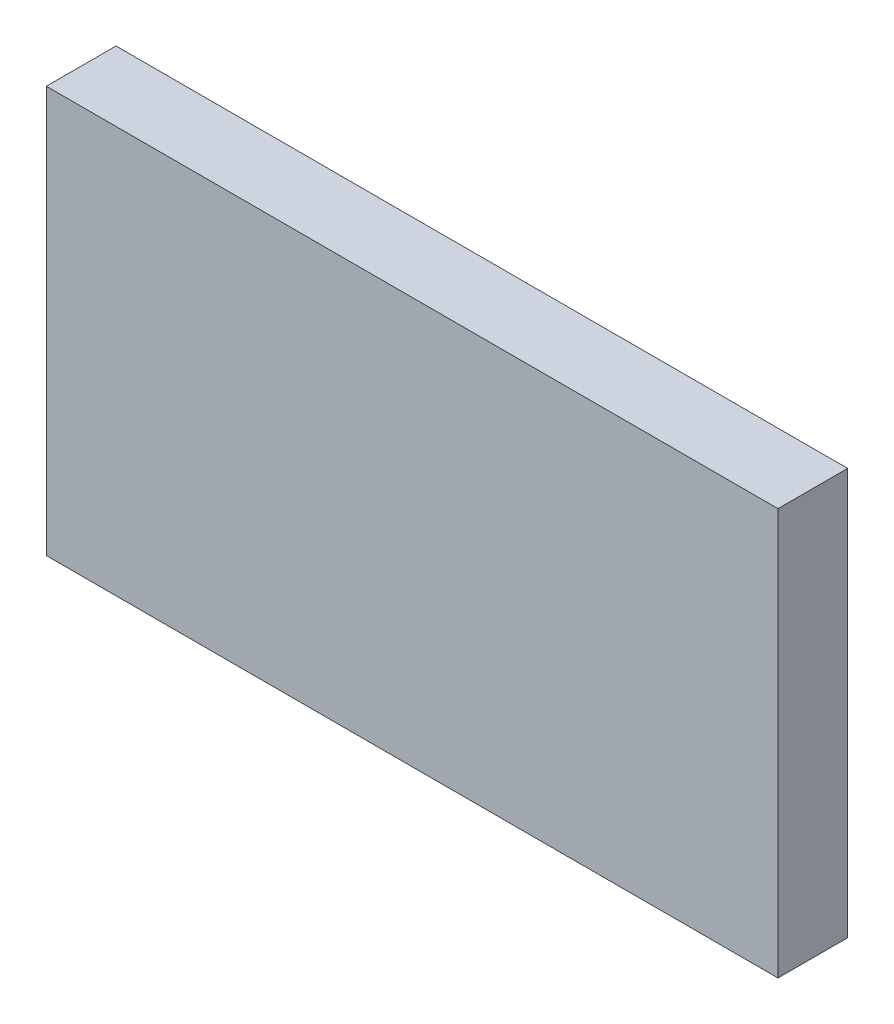
ISO-10303-21;
HEADER;
FILE_DESCRIPTION(('STEP AP214'),'2;1');
FILE_NAME('part.step','',(''),(''),'','','');
FILE_SCHEMA(('AUTOMOTIVE_DESIGN { 1 0 10303 214 1 1 1 1 }'));
ENDSEC;
DATA;
#1=APPLICATION_CONTEXT('core data for automotive mechanical design processes');
#2=APPLICATION_PROTOCOL_DEFINITION('international standard','automotive_design',2000,#1);
#3=PRODUCT_CONTEXT('',#1,'mechanical');
#4=PRODUCT('Part','Part','',(#3));
#5=PRODUCT_RELATED_PRODUCT_CATEGORY('part','',(#4));
#6=PRODUCT_DEFINITION_FORMATION('','',#4);
#7=PRODUCT_DEFINITION_CONTEXT('part definition',#1,'design');
#8=PRODUCT_DEFINITION('design','',#6,#7);
#9=PRODUCT_DEFINITION_SHAPE('','',#8);
#10=(LENGTH_UNIT() NAMED_UNIT(*) SI_UNIT(.MILLI.,.METRE.));
#11=(NAMED_UNIT(*) PLANE_ANGLE_UNIT() SI_UNIT($,.RADIAN.));
#12=(NAMED_UNIT(*) SI_UNIT($,.STERADIAN.) SOLID_ANGLE_UNIT());
#13=UNCERTAINTY_MEASURE_WITH_UNIT(LENGTH_MEASURE(1.E-05),#10,'distance_accuracy_value','');
#14=(GEOMETRIC_REPRESENTATION_CONTEXT(3) GLOBAL_UNCERTAINTY_ASSIGNED_CONTEXT((#13)) GLOBAL_UNIT_ASSIGNED_CONTEXT((#10,
#11,#12)) REPRESENTATION_CONTEXT('',''));
#15=CARTESIAN_POINT('',(0.,0.,0.));
#16=DIRECTION('',(0.,0.,1.));
#17=DIRECTION('',(1.,0.,0.));
#18=AXIS2_PLACEMENT_3D('',#15,#16,#17);
#19=CARTESIAN_POINT('',(0.,0.,12.));
#20=DIRECTION('',(1.,0.,0.));
#21=DIRECTION('',(0.,0.,-1.));
#22=AXIS2_PLACEMENT_3D('',#19,#20,#21);
#23=PLANE('',#22);
#24=DIRECTION('',(0.,-1.,0.));
#25=VECTOR('',#24,1.);
#26=CARTESIAN_POINT('',(0.,0.,0.));
#27=LINE('',#26,#25);
#28=CARTESIAN_POINT('',(0.,70.,0.));
#29=VERTEX_POINT('',#28);
#30=CARTESIAN_POINT('',(0.,0.,0.));
#31=VERTEX_POINT('',#30);
#32=EDGE_CURVE('E96',#29,#31,#27,.T.);
#33=ORIENTED_EDGE('',*,*,#32,.T.);
#34=DIRECTION('',(0.,0.,-1.));
#35=VECTOR('',#34,1.);
#36=CARTESIAN_POINT('',(0.,0.,12.));
#37=LINE('',#36,#35);
#38=CARTESIAN_POINT('',(0.,0.,12.));
#39=VERTEX_POINT('',#38);
#40=EDGE_CURVE('E11',#39,#31,#37,.T.);
#41=ORIENTED_EDGE('',*,*,#40,.F.);
#42=DIRECTION('',(0.,-1.,0.));
#43=VECTOR('',#42,1.);
#44=CARTESIAN_POINT('',(0.,0.,12.));
#45=LINE('',#44,#43);
#46=CARTESIAN_POINT('',(0.,70.,12.));
#47=VERTEX_POINT('',#46);
#48=EDGE_CURVE('E84',#47,#39,#45,.T.);
#49=ORIENTED_EDGE('',*,*,#48,.F.);
#50=DIRECTION('',(0.,0.,-1.));
#51=VECTOR('',#50,1.);
#52=CARTESIAN_POINT('',(0.,70.,12.));
#53=LINE('',#52,#51);
#54=EDGE_CURVE('E92',#47,#29,#53,.T.);
#55=ORIENTED_EDGE('',*,*,#54,.T.);
#56=EDGE_LOOP('',(#33,#41,#49,#55));
#57=FACE_BOUND('',#56,.T.);
#58=ADVANCED_FACE('F33',(#57),#23,.F.);
#59=CARTESIAN_POINT('',(0.,0.,12.));
#60=DIRECTION('',(0.,1.,0.));
#61=DIRECTION('',(0.,0.,1.));
#62=AXIS2_PLACEMENT_3D('',#59,#60,#61);
#63=PLANE('',#62);
#64=DIRECTION('',(1.,0.,0.));
#65=VECTOR('',#64,1.);
#66=CARTESIAN_POINT('',(0.,0.,0.));
#67=LINE('',#66,#65);
#68=CARTESIAN_POINT('',(126.,0.,0.));
#69=VERTEX_POINT('',#68);
#70=EDGE_CURVE('E88',#31,#69,#67,.T.);
#71=ORIENTED_EDGE('',*,*,#70,.T.);
#72=DIRECTION('',(0.,0.,-1.));
#73=VECTOR('',#72,1.);
#74=CARTESIAN_POINT('',(126.,0.,12.));
#75=LINE('',#74,#73);
#76=CARTESIAN_POINT('',(126.,0.,12.));
#77=VERTEX_POINT('',#76);
#78=EDGE_CURVE('E41',#77,#69,#75,.T.);
#79=ORIENTED_EDGE('',*,*,#78,.F.);
#80=DIRECTION('',(1.,0.,0.));
#81=VECTOR('',#80,1.);
#82=CARTESIAN_POINT('',(0.,0.,12.));
#83=LINE('',#82,#81);
#84=EDGE_CURVE('E79',#39,#77,#83,.T.);
#85=ORIENTED_EDGE('',*,*,#84,.F.);
#86=ORIENTED_EDGE('',*,*,#40,.T.);
#87=EDGE_LOOP('',(#71,#79,#85,#86));
#88=FACE_BOUND('',#87,.T.);
#89=ADVANCED_FACE('F87',(#88),#63,.F.);
#90=CARTESIAN_POINT('',(126.,0.,12.));
#91=DIRECTION('',(-1.,0.,0.));
#92=DIRECTION('',(0.,0.,1.));
#93=AXIS2_PLACEMENT_3D('',#90,#91,#92);
#94=PLANE('',#93);
#95=DIRECTION('',(0.,1.,0.));
#96=VECTOR('',#95,1.);
#97=CARTESIAN_POINT('',(126.,0.,0.));
#98=LINE('',#97,#96);
#99=CARTESIAN_POINT('',(126.,70.,0.));
#100=VERTEX_POINT('',#99);
#101=EDGE_CURVE('E66',#69,#100,#98,.T.);
#102=ORIENTED_EDGE('',*,*,#101,.T.);
#103=DIRECTION('',(0.,0.,-1.));
#104=VECTOR('',#103,1.);
#105=CARTESIAN_POINT('',(126.,70.,12.));
#106=LINE('',#105,#104);
#107=CARTESIAN_POINT('',(126.,70.,12.));
#108=VERTEX_POINT('',#107);
#109=EDGE_CURVE('E89',#108,#100,#106,.T.);
#110=ORIENTED_EDGE('',*,*,#109,.F.);
#111=DIRECTION('',(0.,1.,0.));
#112=VECTOR('',#111,1.);
#113=CARTESIAN_POINT('',(126.,0.,12.));
#114=LINE('',#113,#112);
#115=EDGE_CURVE('E82',#77,#108,#114,.T.);
#116=ORIENTED_EDGE('',*,*,#115,.F.);
#117=ORIENTED_EDGE('',*,*,#78,.T.);
#118=EDGE_LOOP('',(#102,#110,#116,#117));
#119=FACE_BOUND('',#118,.T.);
#120=ADVANCED_FACE('F90',(#119),#94,.F.);
#121=CARTESIAN_POINT('',(0.,70.,12.));
#122=DIRECTION('',(0.,-1.,0.));
#123=DIRECTION('',(0.,0.,-1.));
#124=AXIS2_PLACEMENT_3D('',#121,#122,#123);
#125=PLANE('',#124);
#126=DIRECTION('',(-1.,0.,0.));
#127=VECTOR('',#126,1.);
#128=CARTESIAN_POINT('',(0.,70.,0.));
#129=LINE('',#128,#127);
#130=EDGE_CURVE('E72',#100,#29,#129,.T.);
#131=ORIENTED_EDGE('',*,*,#130,.T.);
#132=ORIENTED_EDGE('',*,*,#54,.F.);
#133=DIRECTION('',(-1.,0.,0.));
#134=VECTOR('',#133,1.);
#135=CARTESIAN_POINT('',(0.,70.,12.));
#136=LINE('',#135,#134);
#137=EDGE_CURVE('E49',#108,#47,#136,.T.);
#138=ORIENTED_EDGE('',*,*,#137,.F.);
#139=ORIENTED_EDGE('',*,*,#109,.T.);
#140=EDGE_LOOP('',(#131,#132,#138,#139));
#141=FACE_BOUND('',#140,.T.);
#142=ADVANCED_FACE('F103',(#141),#125,.F.);
#143=CARTESIAN_POINT('',(0.,0.,12.));
#144=DIRECTION('',(0.,0.,-1.));
#145=DIRECTION('',(-1.,0.,0.));
#146=AXIS2_PLACEMENT_3D('',#143,#144,#145);
#147=PLANE('',#146);
#148=ORIENTED_EDGE('',*,*,#48,.T.);
#149=ORIENTED_EDGE('',*,*,#84,.T.);
#150=ORIENTED_EDGE('',*,*,#115,.T.);
#151=ORIENTED_EDGE('',*,*,#137,.T.);
#152=EDGE_LOOP('',(#148,#149,#150,#151));
#153=FACE_BOUND('',#152,.T.);
#154=ADVANCED_FACE('F80',(#153),#147,.F.);
#155=CARTESIAN_POINT('',(0.,0.,0.));
#156=DIRECTION('',(0.,0.,-1.));
#157=DIRECTION('',(-1.,0.,0.));
#158=AXIS2_PLACEMENT_3D('',#155,#156,#157);
#159=PLANE('',#158);
#160=ORIENTED_EDGE('',*,*,#32,.F.);
#161=ORIENTED_EDGE('',*,*,#130,.F.);
#162=ORIENTED_EDGE('',*,*,#101,.F.);
#163=ORIENTED_EDGE('',*,*,#70,.F.);
#164=EDGE_LOOP('',(#160,#161,#162,#163));
#165=FACE_BOUND('',#164,.T.);
#166=ADVANCED_FACE('F106',(#165),#159,.T.);
#167=CLOSED_SHELL('',(#58,#89,#120,#142,#154,#166));
#168=MANIFOLD_SOLID_BREP('B2',#167);
#169=ADVANCED_BREP_SHAPE_REPRESENTATION('',(#18,#168),#14);
#170=SHAPE_DEFINITION_REPRESENTATION(#9,#169);
ENDSEC;
END-ISO-10303-21;
